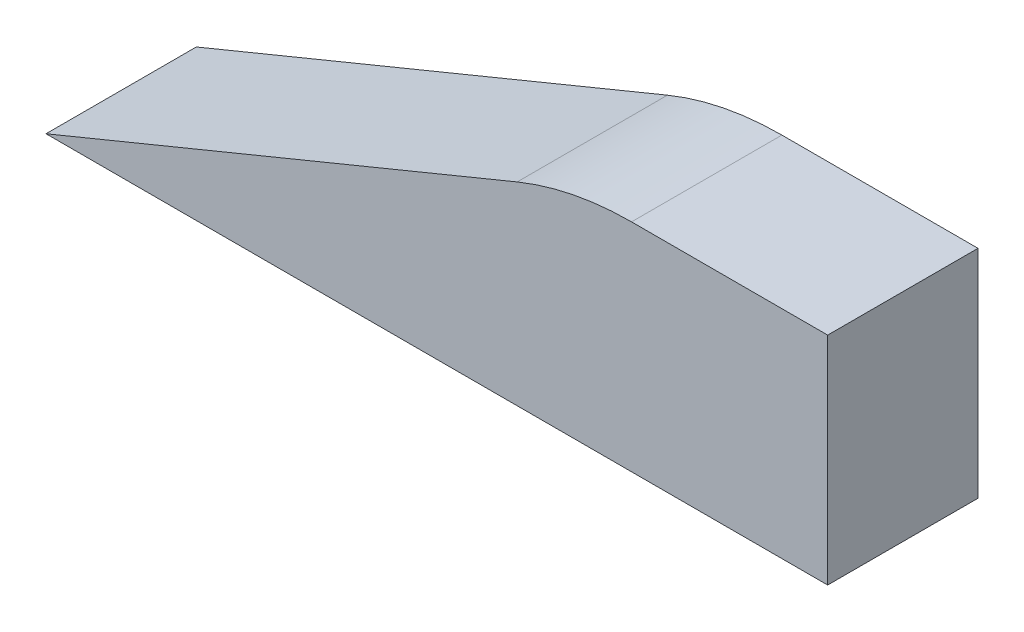
ISO-10303-21;
HEADER;
FILE_DESCRIPTION(('STEP AP214'),'2;1');
FILE_NAME('part.step','',(''),(''),'','','');
FILE_SCHEMA(('AUTOMOTIVE_DESIGN { 1 0 10303 214 1 1 1 1 }'));
ENDSEC;
DATA;
#1=APPLICATION_CONTEXT('core data for automotive mechanical design processes');
#2=APPLICATION_PROTOCOL_DEFINITION('international standard','automotive_design',2000,#1);
#3=PRODUCT_CONTEXT('',#1,'mechanical');
#4=PRODUCT('Part','Part','',(#3));
#5=PRODUCT_RELATED_PRODUCT_CATEGORY('part','',(#4));
#6=PRODUCT_DEFINITION_FORMATION('','',#4);
#7=PRODUCT_DEFINITION_CONTEXT('part definition',#1,'design');
#8=PRODUCT_DEFINITION('design','',#6,#7);
#9=PRODUCT_DEFINITION_SHAPE('','',#8);
#10=(LENGTH_UNIT() NAMED_UNIT(*) SI_UNIT(.MILLI.,.METRE.));
#11=(NAMED_UNIT(*) PLANE_ANGLE_UNIT() SI_UNIT($,.RADIAN.));
#12=(NAMED_UNIT(*) SI_UNIT($,.STERADIAN.) SOLID_ANGLE_UNIT());
#13=UNCERTAINTY_MEASURE_WITH_UNIT(LENGTH_MEASURE(1.E-05),#10,'distance_accuracy_value','');
#14=(GEOMETRIC_REPRESENTATION_CONTEXT(3) GLOBAL_UNCERTAINTY_ASSIGNED_CONTEXT((#13)) GLOBAL_UNIT_ASSIGNED_CONTEXT((#10,
#11,#12)) REPRESENTATION_CONTEXT('',''));
#15=CARTESIAN_POINT('',(0.,0.,0.));
#16=DIRECTION('',(0.,0.,1.));
#17=DIRECTION('',(1.,0.,0.));
#18=AXIS2_PLACEMENT_3D('',#15,#16,#17);
#19=CARTESIAN_POINT('',(-35.,0.,10.));
#20=DIRECTION('',(0.380484001063025,-0.924787502583741,0.));
#21=DIRECTION('',(0.924787502583741,0.380484001063025,0.));
#22=AXIS2_PLACEMENT_3D('',#19,#20,#21);
#23=PLANE('',#22);
#24=DIRECTION('',(-0.924787502583741,-0.380484001063025,0.));
#25=VECTOR('',#24,1.);
#26=CARTESIAN_POINT('',(-35.,0.,10.));
#27=LINE('',#26,#25);
#28=CARTESIAN_POINT('',(-3.65616306884594,12.8957500516748,10.));
#29=VERTEX_POINT('',#28);
#30=CARTESIAN_POINT('',(-35.,0.,10.));
#31=VERTEX_POINT('',#30);
#32=EDGE_CURVE('E93',#29,#31,#27,.T.);
#33=ORIENTED_EDGE('',*,*,#32,.F.);
#34=DIRECTION('',(0.,0.,-1.));
#35=VECTOR('',#34,1.);
#36=CARTESIAN_POINT('',(-3.65616306884595,12.8957500516748,10.));
#37=LINE('',#36,#35);
#38=CARTESIAN_POINT('',(-3.65616306884594,12.8957500516748,0.));
#39=VERTEX_POINT('',#38);
#40=EDGE_CURVE('E135',#29,#39,#37,.T.);
#41=ORIENTED_EDGE('',*,*,#40,.T.);
#42=DIRECTION('',(-0.924787502583741,-0.380484001063025,0.));
#43=VECTOR('',#42,1.);
#44=CARTESIAN_POINT('',(-35.,0.,0.));
#45=LINE('',#44,#43);
#46=CARTESIAN_POINT('',(-35.,0.,0.));
#47=VERTEX_POINT('',#46);
#48=EDGE_CURVE('E126',#39,#47,#45,.T.);
#49=ORIENTED_EDGE('',*,*,#48,.T.);
#50=DIRECTION('',(0.,0.,-1.));
#51=VECTOR('',#50,1.);
#52=CARTESIAN_POINT('',(-35.,0.,10.));
#53=LINE('',#52,#51);
#54=EDGE_CURVE('E98',#31,#47,#53,.T.);
#55=ORIENTED_EDGE('',*,*,#54,.F.);
#56=EDGE_LOOP('',(#33,#41,#49,#55));
#57=FACE_BOUND('',#56,.T.);
#58=ADVANCED_FACE('F39',(#57),#23,.F.);
#59=CARTESIAN_POINT('',(0.,0.,10.));
#60=DIRECTION('',(0.,1.,0.));
#61=DIRECTION('',(-1.,0.,0.));
#62=AXIS2_PLACEMENT_3D('',#59,#60,#61);
#63=PLANE('',#62);
#64=DIRECTION('',(1.,0.,0.));
#65=VECTOR('',#64,1.);
#66=CARTESIAN_POINT('',(0.,0.,0.));
#67=LINE('',#66,#65);
#68=CARTESIAN_POINT('',(17.,0.,0.));
#69=VERTEX_POINT('',#68);
#70=EDGE_CURVE('E104',#47,#69,#67,.T.);
#71=ORIENTED_EDGE('',*,*,#70,.T.);
#72=DIRECTION('',(0.,0.,-1.));
#73=VECTOR('',#72,1.);
#74=CARTESIAN_POINT('',(17.,0.,10.));
#75=LINE('',#74,#73);
#76=CARTESIAN_POINT('',(17.,0.,10.));
#77=VERTEX_POINT('',#76);
#78=EDGE_CURVE('E101',#77,#69,#75,.T.);
#79=ORIENTED_EDGE('',*,*,#78,.F.);
#80=DIRECTION('',(1.,0.,0.));
#81=VECTOR('',#80,1.);
#82=CARTESIAN_POINT('',(0.,0.,10.));
#83=LINE('',#82,#81);
#84=EDGE_CURVE('E87',#31,#77,#83,.T.);
#85=ORIENTED_EDGE('',*,*,#84,.F.);
#86=ORIENTED_EDGE('',*,*,#54,.T.);
#87=EDGE_LOOP('',(#71,#79,#85,#86));
#88=FACE_BOUND('',#87,.T.);
#89=ADVANCED_FACE('F102',(#88),#63,.F.);
#90=CARTESIAN_POINT('',(0.,0.,10.));
#91=DIRECTION('',(0.,0.,1.));
#92=DIRECTION('',(1.,0.,0.));
#93=AXIS2_PLACEMENT_3D('',#90,#91,#92);
#94=PLANE('',#93);
#95=DIRECTION('',(-1.,0.,0.));
#96=VECTOR('',#95,1.);
#97=CARTESIAN_POINT('',(17.,14.4,10.));
#98=LINE('',#97,#96);
#99=CARTESIAN_POINT('',(17.,14.4,10.));
#100=VERTEX_POINT('',#99);
#101=CARTESIAN_POINT('',(3.95351695241455,14.4,10.));
#102=VERTEX_POINT('',#101);
#103=EDGE_CURVE('E120',#100,#102,#98,.T.);
#104=ORIENTED_EDGE('',*,*,#103,.T.);
#105=CARTESIAN_POINT('',(3.95351695241455,-5.6,10.));
#106=DIRECTION('',(0.,0.,1.));
#107=DIRECTION('',(1.,0.,0.));
#108=AXIS2_PLACEMENT_3D('',#105,#106,#107);
#109=CIRCLE('',#108,20.);
#110=EDGE_CURVE('E11',#102,#29,#109,.T.);
#111=ORIENTED_EDGE('',*,*,#110,.T.);
#112=ORIENTED_EDGE('',*,*,#32,.T.);
#113=ORIENTED_EDGE('',*,*,#84,.T.);
#114=DIRECTION('',(0.,-1.,0.));
#115=VECTOR('',#114,1.);
#116=CARTESIAN_POINT('',(17.,14.4,10.));
#117=LINE('',#116,#115);
#118=EDGE_CURVE('E91',#100,#77,#117,.T.);
#119=ORIENTED_EDGE('',*,*,#118,.F.);
#120=EDGE_LOOP('',(#104,#111,#112,#113,#119));
#121=FACE_BOUND('',#120,.T.);
#122=ADVANCED_FACE('F89',(#121),#94,.T.);
#123=CARTESIAN_POINT('',(0.,0.,0.));
#124=DIRECTION('',(0.,0.,1.));
#125=DIRECTION('',(1.,0.,0.));
#126=AXIS2_PLACEMENT_3D('',#123,#124,#125);
#127=PLANE('',#126);
#128=ORIENTED_EDGE('',*,*,#48,.F.);
#129=CARTESIAN_POINT('',(3.95351695241455,-5.6,0.));
#130=DIRECTION('',(0.,0.,1.));
#131=DIRECTION('',(1.,0.,0.));
#132=AXIS2_PLACEMENT_3D('',#129,#130,#131);
#133=CIRCLE('',#132,20.);
#134=CARTESIAN_POINT('',(3.95351695241455,14.4,0.));
#135=VERTEX_POINT('',#134);
#136=EDGE_CURVE('E62',#39,#135,#133,.F.);
#137=ORIENTED_EDGE('',*,*,#136,.T.);
#138=DIRECTION('',(-1.,0.,0.));
#139=VECTOR('',#138,1.);
#140=CARTESIAN_POINT('',(17.,14.4,0.));
#141=LINE('',#140,#139);
#142=CARTESIAN_POINT('',(17.,14.4,0.));
#143=VERTEX_POINT('',#142);
#144=EDGE_CURVE('E123',#143,#135,#141,.T.);
#145=ORIENTED_EDGE('',*,*,#144,.F.);
#146=DIRECTION('',(0.,1.,0.));
#147=VECTOR('',#146,1.);
#148=CARTESIAN_POINT('',(17.,14.4,0.));
#149=LINE('',#148,#147);
#150=EDGE_CURVE('E108',#69,#143,#149,.T.);
#151=ORIENTED_EDGE('',*,*,#150,.F.);
#152=ORIENTED_EDGE('',*,*,#70,.F.);
#153=EDGE_LOOP('',(#128,#137,#145,#151,#152));
#154=FACE_BOUND('',#153,.T.);
#155=ADVANCED_FACE('F145',(#154),#127,.F.);
#156=CARTESIAN_POINT('',(17.,14.4,10.));
#157=DIRECTION('',(0.,-1.,0.));
#158=DIRECTION('',(0.,0.,-1.));
#159=AXIS2_PLACEMENT_3D('',#156,#157,#158);
#160=PLANE('',#159);
#161=ORIENTED_EDGE('',*,*,#144,.T.);
#162=DIRECTION('',(0.,0.,-1.));
#163=VECTOR('',#162,1.);
#164=CARTESIAN_POINT('',(3.95351695241455,14.4,10.));
#165=LINE('',#164,#163);
#166=EDGE_CURVE('E48',#135,#102,#165,.F.);
#167=ORIENTED_EDGE('',*,*,#166,.T.);
#168=ORIENTED_EDGE('',*,*,#103,.F.);
#169=DIRECTION('',(0.,0.,1.));
#170=VECTOR('',#169,1.);
#171=CARTESIAN_POINT('',(17.,14.4,10.));
#172=LINE('',#171,#170);
#173=EDGE_CURVE('E112',#143,#100,#172,.T.);
#174=ORIENTED_EDGE('',*,*,#173,.F.);
#175=EDGE_LOOP('',(#161,#167,#168,#174));
#176=FACE_BOUND('',#175,.T.);
#177=ADVANCED_FACE('F146',(#176),#160,.F.);
#178=CARTESIAN_POINT('',(17.,0.,0.));
#179=DIRECTION('',(1.,0.,0.));
#180=DIRECTION('',(0.,0.,-1.));
#181=AXIS2_PLACEMENT_3D('',#178,#179,#180);
#182=PLANE('',#181);
#183=ORIENTED_EDGE('',*,*,#118,.T.);
#184=ORIENTED_EDGE('',*,*,#78,.T.);
#185=ORIENTED_EDGE('',*,*,#150,.T.);
#186=ORIENTED_EDGE('',*,*,#173,.T.);
#187=EDGE_LOOP('',(#183,#184,#185,#186));
#188=FACE_BOUND('',#187,.T.);
#189=ADVANCED_FACE('F110',(#188),#182,.T.);
#190=CARTESIAN_POINT('',(3.95351695241455,-5.6,10.));
#191=DIRECTION('',(0.,0.,-1.));
#192=DIRECTION('',(-1.,0.,0.));
#193=AXIS2_PLACEMENT_3D('',#190,#191,#192);
#194=CYLINDRICAL_SURFACE('',#193,20.);
#195=ORIENTED_EDGE('',*,*,#110,.F.);
#196=ORIENTED_EDGE('',*,*,#166,.F.);
#197=ORIENTED_EDGE('',*,*,#136,.F.);
#198=ORIENTED_EDGE('',*,*,#40,.F.);
#199=EDGE_LOOP('',(#195,#196,#197,#198));
#200=FACE_BOUND('',#199,.T.);
#201=ADVANCED_FACE('F41',(#200),#194,.T.);
#202=CLOSED_SHELL('',(#58,#89,#122,#155,#177,#189,#201));
#203=MANIFOLD_SOLID_BREP('B2',#202);
#204=ADVANCED_BREP_SHAPE_REPRESENTATION('',(#18,#203),#14);
#205=SHAPE_DEFINITION_REPRESENTATION(#9,#204);
ENDSEC;
END-ISO-10303-21;
